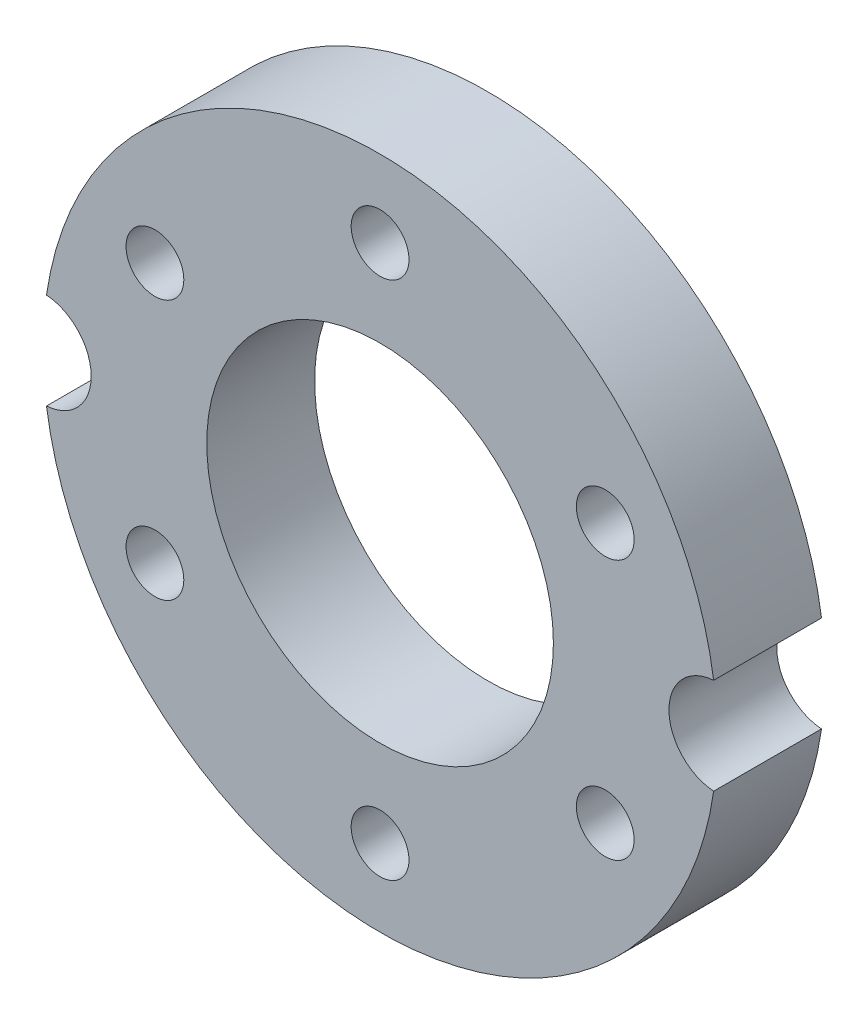
ISO-10303-21;
HEADER;
FILE_DESCRIPTION(('STEP AP214'),'2;1');
FILE_NAME('part.step','',(''),(''),'','','');
FILE_SCHEMA(('AUTOMOTIVE_DESIGN { 1 0 10303 214 1 1 1 1 }'));
ENDSEC;
DATA;
#1=APPLICATION_CONTEXT('core data for automotive mechanical design processes');
#2=APPLICATION_PROTOCOL_DEFINITION('international standard','automotive_design',2000,#1);
#3=PRODUCT_CONTEXT('',#1,'mechanical');
#4=PRODUCT('Part','Part','',(#3));
#5=PRODUCT_RELATED_PRODUCT_CATEGORY('part','',(#4));
#6=PRODUCT_DEFINITION_FORMATION('','',#4);
#7=PRODUCT_DEFINITION_CONTEXT('part definition',#1,'design');
#8=PRODUCT_DEFINITION('design','',#6,#7);
#9=PRODUCT_DEFINITION_SHAPE('','',#8);
#10=(LENGTH_UNIT() NAMED_UNIT(*) SI_UNIT(.MILLI.,.METRE.));
#11=(NAMED_UNIT(*) PLANE_ANGLE_UNIT() SI_UNIT($,.RADIAN.));
#12=(NAMED_UNIT(*) SI_UNIT($,.STERADIAN.) SOLID_ANGLE_UNIT());
#13=UNCERTAINTY_MEASURE_WITH_UNIT(LENGTH_MEASURE(1.E-05),#10,'distance_accuracy_value','');
#14=(GEOMETRIC_REPRESENTATION_CONTEXT(3) GLOBAL_UNCERTAINTY_ASSIGNED_CONTEXT((#13)) GLOBAL_UNIT_ASSIGNED_CONTEXT((#10,
#11,#12)) REPRESENTATION_CONTEXT('',''));
#15=CARTESIAN_POINT('',(0.,0.,0.));
#16=DIRECTION('',(0.,0.,1.));
#17=DIRECTION('',(1.,0.,0.));
#18=AXIS2_PLACEMENT_3D('',#15,#16,#17);
#19=CARTESIAN_POINT('',(0.,0.,5.6));
#20=DIRECTION('',(0.,0.,-1.));
#21=DIRECTION('',(-1.,0.,0.));
#22=AXIS2_PLACEMENT_3D('',#19,#20,#21);
#23=CYLINDRICAL_SURFACE('',#22,17.5);
#24=CARTESIAN_POINT('',(0.,0.,0.));
#25=DIRECTION('',(0.,0.,1.));
#26=DIRECTION('',(1.,0.,0.));
#27=AXIS2_PLACEMENT_3D('',#24,#25,#26);
#28=CIRCLE('',#27,17.5);
#29=CARTESIAN_POINT('',(-17.3214285714286,-2.49361429353015,0.));
#30=VERTEX_POINT('',#29);
#31=CARTESIAN_POINT('',(17.3214285714286,-2.49361429353015,0.));
#32=VERTEX_POINT('',#31);
#33=EDGE_CURVE('E135',#30,#32,#28,.T.);
#34=ORIENTED_EDGE('',*,*,#33,.T.);
#35=DIRECTION('',(0.,0.,-1.));
#36=VECTOR('',#35,1.);
#37=CARTESIAN_POINT('',(17.3214285714286,-2.49361429353015,5.6));
#38=LINE('',#37,#36);
#39=CARTESIAN_POINT('',(17.3214285714286,-2.49361429353015,5.6));
#40=VERTEX_POINT('',#39);
#41=EDGE_CURVE('E11',#40,#32,#38,.T.);
#42=ORIENTED_EDGE('',*,*,#41,.F.);
#43=CARTESIAN_POINT('',(0.,0.,5.6));
#44=DIRECTION('',(0.,0.,1.));
#45=DIRECTION('',(1.,0.,0.));
#46=AXIS2_PLACEMENT_3D('',#43,#44,#45);
#47=CIRCLE('',#46,17.5);
#48=CARTESIAN_POINT('',(-17.3214285714286,-2.49361429353015,5.6));
#49=VERTEX_POINT('',#48);
#50=EDGE_CURVE('E91',#49,#40,#47,.T.);
#51=ORIENTED_EDGE('',*,*,#50,.F.);
#52=DIRECTION('',(0.,0.,-1.));
#53=VECTOR('',#52,1.);
#54=CARTESIAN_POINT('',(-17.3214285714286,-2.49361429353015,5.6));
#55=LINE('',#54,#53);
#56=EDGE_CURVE('E57',#49,#30,#55,.T.);
#57=ORIENTED_EDGE('',*,*,#56,.T.);
#58=EDGE_LOOP('',(#34,#42,#51,#57));
#59=FACE_BOUND('',#58,.T.);
#60=ADVANCED_FACE('F40',(#59),#23,.T.);
#61=CARTESIAN_POINT('',(17.5,0.,5.6));
#62=DIRECTION('',(0.,0.,-1.));
#63=DIRECTION('',(-1.,0.,0.));
#64=AXIS2_PLACEMENT_3D('',#61,#62,#63);
#65=CYLINDRICAL_SURFACE('',#64,2.5);
#66=CARTESIAN_POINT('',(17.5,0.,0.));
#67=DIRECTION('',(0.,0.,1.));
#68=DIRECTION('',(1.,0.,0.));
#69=AXIS2_PLACEMENT_3D('',#66,#67,#68);
#70=CIRCLE('',#69,2.5);
#71=CARTESIAN_POINT('',(17.3214285714286,2.49361429353016,0.));
#72=VERTEX_POINT('',#71);
#73=EDGE_CURVE('E96',#32,#72,#70,.F.);
#74=ORIENTED_EDGE('',*,*,#73,.T.);
#75=DIRECTION('',(0.,0.,-1.));
#76=VECTOR('',#75,1.);
#77=CARTESIAN_POINT('',(17.3214285714286,2.49361429353016,5.6));
#78=LINE('',#77,#76);
#79=CARTESIAN_POINT('',(17.3214285714286,2.49361429353016,5.6));
#80=VERTEX_POINT('',#79);
#81=EDGE_CURVE('E49',#80,#72,#78,.T.);
#82=ORIENTED_EDGE('',*,*,#81,.F.);
#83=CARTESIAN_POINT('',(17.5,0.,5.6));
#84=DIRECTION('',(0.,0.,1.));
#85=DIRECTION('',(1.,0.,0.));
#86=AXIS2_PLACEMENT_3D('',#83,#84,#85);
#87=CIRCLE('',#86,2.5);
#88=EDGE_CURVE('E83',#40,#80,#87,.F.);
#89=ORIENTED_EDGE('',*,*,#88,.F.);
#90=ORIENTED_EDGE('',*,*,#41,.T.);
#91=EDGE_LOOP('',(#74,#82,#89,#90));
#92=FACE_BOUND('',#91,.T.);
#93=ADVANCED_FACE('F95',(#92),#65,.F.);
#94=CARTESIAN_POINT('',(-17.3214285714286,2.49361429353015,0.));
#95=VERTEX_POINT('',#94);
#96=EDGE_CURVE('E137',#72,#95,#28,.T.);
#97=ORIENTED_EDGE('',*,*,#96,.T.);
#98=DIRECTION('',(0.,0.,-1.));
#99=VECTOR('',#98,1.);
#100=CARTESIAN_POINT('',(-17.3214285714286,2.49361429353015,5.6));
#101=LINE('',#100,#99);
#102=CARTESIAN_POINT('',(-17.3214285714286,2.49361429353015,5.6));
#103=VERTEX_POINT('',#102);
#104=EDGE_CURVE('E72',#103,#95,#101,.T.);
#105=ORIENTED_EDGE('',*,*,#104,.F.);
#106=EDGE_CURVE('E90',#80,#103,#47,.T.);
#107=ORIENTED_EDGE('',*,*,#106,.F.);
#108=ORIENTED_EDGE('',*,*,#81,.T.);
#109=EDGE_LOOP('',(#97,#105,#107,#108));
#110=FACE_BOUND('',#109,.T.);
#111=ADVANCED_FACE('F99',(#110),#23,.T.);
#112=CARTESIAN_POINT('',(11.6913429510899,6.75000000000001,5.6));
#113=DIRECTION('',(0.,0.,-1.));
#114=DIRECTION('',(-1.,0.,0.));
#115=AXIS2_PLACEMENT_3D('',#112,#113,#114);
#116=CYLINDRICAL_SURFACE('',#115,1.5);
#117=CARTESIAN_POINT('',(11.6913429510899,6.75000000000001,5.6));
#118=DIRECTION('',(0.,0.,1.));
#119=DIRECTION('',(1.,0.,0.));
#120=AXIS2_PLACEMENT_3D('',#117,#118,#119);
#121=CIRCLE('',#120,1.5);
#122=CARTESIAN_POINT('',(13.1913429510899,6.75000000000001,5.6));
#123=VERTEX_POINT('',#122);
#124=EDGE_CURVE('E123',#123,#123,#121,.T.);
#125=ORIENTED_EDGE('',*,*,#124,.T.);
#126=EDGE_LOOP('',(#125));
#127=FACE_BOUND('',#126,.T.);
#128=CARTESIAN_POINT('',(11.6913429510899,6.75000000000001,0.));
#129=DIRECTION('',(0.,0.,1.));
#130=DIRECTION('',(1.,0.,0.));
#131=AXIS2_PLACEMENT_3D('',#128,#129,#130);
#132=CIRCLE('',#131,1.5);
#133=CARTESIAN_POINT('',(13.1913429510899,6.75000000000001,0.));
#134=VERTEX_POINT('',#133);
#135=EDGE_CURVE('E111',#134,#134,#132,.T.);
#136=ORIENTED_EDGE('',*,*,#135,.F.);
#137=EDGE_LOOP('',(#136));
#138=FACE_BOUND('',#137,.T.);
#139=ADVANCED_FACE('F159',(#127,#138),#116,.F.);
#140=CARTESIAN_POINT('',(-11.6913429510899,-6.75000000000001,5.6));
#141=DIRECTION('',(0.,0.,-1.));
#142=DIRECTION('',(-1.,0.,0.));
#143=AXIS2_PLACEMENT_3D('',#140,#141,#142);
#144=CYLINDRICAL_SURFACE('',#143,1.5);
#145=CARTESIAN_POINT('',(-11.6913429510899,-6.75000000000001,5.6));
#146=DIRECTION('',(0.,0.,1.));
#147=DIRECTION('',(1.,0.,0.));
#148=AXIS2_PLACEMENT_3D('',#145,#146,#147);
#149=CIRCLE('',#148,1.5);
#150=CARTESIAN_POINT('',(-10.1913429510899,-6.75000000000001,5.6));
#151=VERTEX_POINT('',#150);
#152=EDGE_CURVE('E128',#151,#151,#149,.T.);
#153=ORIENTED_EDGE('',*,*,#152,.T.);
#154=EDGE_LOOP('',(#153));
#155=FACE_BOUND('',#154,.T.);
#156=CARTESIAN_POINT('',(-11.6913429510899,-6.75000000000001,0.));
#157=DIRECTION('',(0.,0.,1.));
#158=DIRECTION('',(1.,0.,0.));
#159=AXIS2_PLACEMENT_3D('',#156,#157,#158);
#160=CIRCLE('',#159,1.5);
#161=CARTESIAN_POINT('',(-10.1913429510899,-6.75000000000001,0.));
#162=VERTEX_POINT('',#161);
#163=EDGE_CURVE('E116',#162,#162,#160,.T.);
#164=ORIENTED_EDGE('',*,*,#163,.F.);
#165=EDGE_LOOP('',(#164));
#166=FACE_BOUND('',#165,.T.);
#167=ADVANCED_FACE('F156',(#155,#166),#144,.F.);
#168=CARTESIAN_POINT('',(-11.6913429510899,6.74999999999999,5.6));
#169=DIRECTION('',(0.,0.,-1.));
#170=DIRECTION('',(-1.,0.,0.));
#171=AXIS2_PLACEMENT_3D('',#168,#169,#170);
#172=CYLINDRICAL_SURFACE('',#171,1.5);
#173=CARTESIAN_POINT('',(-11.6913429510899,6.74999999999999,5.6));
#174=DIRECTION('',(0.,0.,1.));
#175=DIRECTION('',(1.,0.,0.));
#176=AXIS2_PLACEMENT_3D('',#173,#174,#175);
#177=CIRCLE('',#176,1.5);
#178=CARTESIAN_POINT('',(-10.1913429510899,6.74999999999999,5.6));
#179=VERTEX_POINT('',#178);
#180=EDGE_CURVE('E322',#179,#179,#177,.T.);
#181=ORIENTED_EDGE('',*,*,#180,.T.);
#182=EDGE_LOOP('',(#181));
#183=FACE_BOUND('',#182,.T.);
#184=CARTESIAN_POINT('',(-11.6913429510899,6.74999999999999,0.));
#185=DIRECTION('',(0.,0.,1.));
#186=DIRECTION('',(1.,0.,0.));
#187=AXIS2_PLACEMENT_3D('',#184,#185,#186);
#188=CIRCLE('',#187,1.5);
#189=CARTESIAN_POINT('',(-10.1913429510899,6.74999999999999,0.));
#190=VERTEX_POINT('',#189);
#191=EDGE_CURVE('E148',#190,#190,#188,.T.);
#192=ORIENTED_EDGE('',*,*,#191,.F.);
#193=EDGE_LOOP('',(#192));
#194=FACE_BOUND('',#193,.T.);
#195=ADVANCED_FACE('F158',(#183,#194),#172,.F.);
#196=CARTESIAN_POINT('',(0.,0.,5.6));
#197=DIRECTION('',(0.,0.,-1.));
#198=DIRECTION('',(-1.,0.,0.));
#199=AXIS2_PLACEMENT_3D('',#196,#197,#198);
#200=CYLINDRICAL_SURFACE('',#199,9.);
#201=CARTESIAN_POINT('',(0.,0.,5.6));
#202=DIRECTION('',(0.,0.,1.));
#203=DIRECTION('',(1.,0.,0.));
#204=AXIS2_PLACEMENT_3D('',#201,#202,#203);
#205=CIRCLE('',#204,9.);
#206=CARTESIAN_POINT('',(9.,0.,5.6));
#207=VERTEX_POINT('',#206);
#208=EDGE_CURVE('E319',#207,#207,#205,.T.);
#209=ORIENTED_EDGE('',*,*,#208,.T.);
#210=EDGE_LOOP('',(#209));
#211=FACE_BOUND('',#210,.T.);
#212=CARTESIAN_POINT('',(0.,0.,0.));
#213=DIRECTION('',(0.,0.,1.));
#214=DIRECTION('',(1.,0.,0.));
#215=AXIS2_PLACEMENT_3D('',#212,#213,#214);
#216=CIRCLE('',#215,9.);
#217=CARTESIAN_POINT('',(9.,0.,0.));
#218=VERTEX_POINT('',#217);
#219=EDGE_CURVE('E145',#218,#218,#216,.T.);
#220=ORIENTED_EDGE('',*,*,#219,.F.);
#221=EDGE_LOOP('',(#220));
#222=FACE_BOUND('',#221,.T.);
#223=ADVANCED_FACE('F166',(#211,#222),#200,.F.);
#224=CARTESIAN_POINT('',(0.,-13.5,5.6));
#225=DIRECTION('',(0.,0.,-1.));
#226=DIRECTION('',(-1.,0.,0.));
#227=AXIS2_PLACEMENT_3D('',#224,#225,#226);
#228=CYLINDRICAL_SURFACE('',#227,1.5);
#229=CARTESIAN_POINT('',(0.,-13.5,5.6));
#230=DIRECTION('',(0.,0.,1.));
#231=DIRECTION('',(1.,0.,0.));
#232=AXIS2_PLACEMENT_3D('',#229,#230,#231);
#233=CIRCLE('',#232,1.5);
#234=CARTESIAN_POINT('',(1.5,-13.5,5.6));
#235=VERTEX_POINT('',#234);
#236=EDGE_CURVE('E102',#235,#235,#233,.T.);
#237=ORIENTED_EDGE('',*,*,#236,.T.);
#238=EDGE_LOOP('',(#237));
#239=FACE_BOUND('',#238,.T.);
#240=CARTESIAN_POINT('',(0.,-13.5,0.));
#241=DIRECTION('',(0.,0.,1.));
#242=DIRECTION('',(1.,0.,0.));
#243=AXIS2_PLACEMENT_3D('',#240,#241,#242);
#244=CIRCLE('',#243,1.5);
#245=CARTESIAN_POINT('',(1.5,-13.5,0.));
#246=VERTEX_POINT('',#245);
#247=EDGE_CURVE('E142',#246,#246,#244,.T.);
#248=ORIENTED_EDGE('',*,*,#247,.F.);
#249=EDGE_LOOP('',(#248));
#250=FACE_BOUND('',#249,.T.);
#251=ADVANCED_FACE('F209',(#239,#250),#228,.F.);
#252=CARTESIAN_POINT('',(-17.5,0.,5.6));
#253=DIRECTION('',(0.,0.,-1.));
#254=DIRECTION('',(-1.,0.,0.));
#255=AXIS2_PLACEMENT_3D('',#252,#253,#254);
#256=CYLINDRICAL_SURFACE('',#255,2.5);
#257=CARTESIAN_POINT('',(-17.5,0.,0.));
#258=DIRECTION('',(0.,0.,1.));
#259=DIRECTION('',(1.,0.,0.));
#260=AXIS2_PLACEMENT_3D('',#257,#258,#259);
#261=CIRCLE('',#260,2.5);
#262=EDGE_CURVE('E139',#30,#95,#261,.T.);
#263=ORIENTED_EDGE('',*,*,#262,.F.);
#264=ORIENTED_EDGE('',*,*,#56,.F.);
#265=CARTESIAN_POINT('',(-17.5,0.,5.6));
#266=DIRECTION('',(0.,0.,1.));
#267=DIRECTION('',(1.,0.,0.));
#268=AXIS2_PLACEMENT_3D('',#265,#266,#267);
#269=CIRCLE('',#268,2.5);
#270=EDGE_CURVE('E100',#49,#103,#269,.T.);
#271=ORIENTED_EDGE('',*,*,#270,.T.);
#272=ORIENTED_EDGE('',*,*,#104,.T.);
#273=EDGE_LOOP('',(#263,#264,#271,#272));
#274=FACE_BOUND('',#273,.T.);
#275=ADVANCED_FACE('F220',(#274),#256,.F.);
#276=CARTESIAN_POINT('',(0.,13.5,5.6));
#277=DIRECTION('',(0.,0.,-1.));
#278=DIRECTION('',(-1.,0.,0.));
#279=AXIS2_PLACEMENT_3D('',#276,#277,#278);
#280=CYLINDRICAL_SURFACE('',#279,1.5);
#281=CARTESIAN_POINT('',(0.,13.5,5.6));
#282=DIRECTION('',(0.,0.,1.));
#283=DIRECTION('',(1.,0.,0.));
#284=AXIS2_PLACEMENT_3D('',#281,#282,#283);
#285=CIRCLE('',#284,1.5);
#286=CARTESIAN_POINT('',(1.5,13.5,5.6));
#287=VERTEX_POINT('',#286);
#288=EDGE_CURVE('E105',#287,#287,#285,.T.);
#289=ORIENTED_EDGE('',*,*,#288,.T.);
#290=EDGE_LOOP('',(#289));
#291=FACE_BOUND('',#290,.T.);
#292=CARTESIAN_POINT('',(0.,13.5,0.));
#293=DIRECTION('',(0.,0.,1.));
#294=DIRECTION('',(1.,0.,0.));
#295=AXIS2_PLACEMENT_3D('',#292,#293,#294);
#296=CIRCLE('',#295,1.5);
#297=CARTESIAN_POINT('',(1.5,13.5,0.));
#298=VERTEX_POINT('',#297);
#299=EDGE_CURVE('E132',#298,#298,#296,.T.);
#300=ORIENTED_EDGE('',*,*,#299,.F.);
#301=EDGE_LOOP('',(#300));
#302=FACE_BOUND('',#301,.T.);
#303=ADVANCED_FACE('F42',(#291,#302),#280,.F.);
#304=CARTESIAN_POINT('',(11.6913429510899,-6.75,5.6));
#305=DIRECTION('',(0.,0.,-1.));
#306=DIRECTION('',(-1.,0.,0.));
#307=AXIS2_PLACEMENT_3D('',#304,#305,#306);
#308=CYLINDRICAL_SURFACE('',#307,1.5);
#309=CARTESIAN_POINT('',(11.6913429510899,-6.75,5.6));
#310=DIRECTION('',(0.,0.,1.));
#311=DIRECTION('',(1.,0.,0.));
#312=AXIS2_PLACEMENT_3D('',#309,#310,#311);
#313=CIRCLE('',#312,1.5);
#314=CARTESIAN_POINT('',(13.1913429510899,-6.75,5.6));
#315=VERTEX_POINT('',#314);
#316=EDGE_CURVE('E121',#315,#315,#313,.T.);
#317=ORIENTED_EDGE('',*,*,#316,.T.);
#318=EDGE_LOOP('',(#317));
#319=FACE_BOUND('',#318,.T.);
#320=CARTESIAN_POINT('',(11.6913429510899,-6.75,0.));
#321=DIRECTION('',(0.,0.,1.));
#322=DIRECTION('',(1.,0.,0.));
#323=AXIS2_PLACEMENT_3D('',#320,#321,#322);
#324=CIRCLE('',#323,1.5);
#325=CARTESIAN_POINT('',(13.1913429510899,-6.75,0.));
#326=VERTEX_POINT('',#325);
#327=EDGE_CURVE('E107',#326,#326,#324,.T.);
#328=ORIENTED_EDGE('',*,*,#327,.F.);
#329=EDGE_LOOP('',(#328));
#330=FACE_BOUND('',#329,.T.);
#331=ADVANCED_FACE('F239',(#319,#330),#308,.F.);
#332=CARTESIAN_POINT('',(0.,0.,5.6));
#333=DIRECTION('',(0.,0.,1.));
#334=DIRECTION('',(1.,0.,0.));
#335=AXIS2_PLACEMENT_3D('',#332,#333,#334);
#336=PLANE('',#335);
#337=ORIENTED_EDGE('',*,*,#288,.F.);
#338=EDGE_LOOP('',(#337));
#339=FACE_BOUND('',#338,.T.);
#340=ORIENTED_EDGE('',*,*,#50,.T.);
#341=ORIENTED_EDGE('',*,*,#88,.T.);
#342=ORIENTED_EDGE('',*,*,#106,.T.);
#343=ORIENTED_EDGE('',*,*,#270,.F.);
#344=EDGE_LOOP('',(#340,#341,#342,#343));
#345=FACE_BOUND('',#344,.T.);
#346=ORIENTED_EDGE('',*,*,#236,.F.);
#347=EDGE_LOOP('',(#346));
#348=FACE_BOUND('',#347,.T.);
#349=ORIENTED_EDGE('',*,*,#208,.F.);
#350=EDGE_LOOP('',(#349));
#351=FACE_BOUND('',#350,.T.);
#352=ORIENTED_EDGE('',*,*,#180,.F.);
#353=EDGE_LOOP('',(#352));
#354=FACE_BOUND('',#353,.T.);
#355=ORIENTED_EDGE('',*,*,#152,.F.);
#356=EDGE_LOOP('',(#355));
#357=FACE_BOUND('',#356,.T.);
#358=ORIENTED_EDGE('',*,*,#124,.F.);
#359=EDGE_LOOP('',(#358));
#360=FACE_BOUND('',#359,.T.);
#361=ORIENTED_EDGE('',*,*,#316,.F.);
#362=EDGE_LOOP('',(#361));
#363=FACE_BOUND('',#362,.T.);
#364=ADVANCED_FACE('F86',(#339,#345,#348,#351,#354,#357,#360,#363),#336,.T.);
#365=CARTESIAN_POINT('',(0.,0.,0.));
#366=DIRECTION('',(0.,0.,1.));
#367=DIRECTION('',(1.,0.,0.));
#368=AXIS2_PLACEMENT_3D('',#365,#366,#367);
#369=PLANE('',#368);
#370=ORIENTED_EDGE('',*,*,#299,.T.);
#371=EDGE_LOOP('',(#370));
#372=FACE_BOUND('',#371,.T.);
#373=ORIENTED_EDGE('',*,*,#33,.F.);
#374=ORIENTED_EDGE('',*,*,#262,.T.);
#375=ORIENTED_EDGE('',*,*,#96,.F.);
#376=ORIENTED_EDGE('',*,*,#73,.F.);
#377=EDGE_LOOP('',(#373,#374,#375,#376));
#378=FACE_BOUND('',#377,.T.);
#379=ORIENTED_EDGE('',*,*,#247,.T.);
#380=EDGE_LOOP('',(#379));
#381=FACE_BOUND('',#380,.T.);
#382=ORIENTED_EDGE('',*,*,#219,.T.);
#383=EDGE_LOOP('',(#382));
#384=FACE_BOUND('',#383,.T.);
#385=ORIENTED_EDGE('',*,*,#191,.T.);
#386=EDGE_LOOP('',(#385));
#387=FACE_BOUND('',#386,.T.);
#388=ORIENTED_EDGE('',*,*,#163,.T.);
#389=EDGE_LOOP('',(#388));
#390=FACE_BOUND('',#389,.T.);
#391=ORIENTED_EDGE('',*,*,#135,.T.);
#392=EDGE_LOOP('',(#391));
#393=FACE_BOUND('',#392,.T.);
#394=ORIENTED_EDGE('',*,*,#327,.T.);
#395=EDGE_LOOP('',(#394));
#396=FACE_BOUND('',#395,.T.);
#397=ADVANCED_FACE('F153',(#372,#378,#381,#384,#387,#390,#393,#396),#369,.F.);
#398=CLOSED_SHELL('',(#60,#93,#111,#139,#167,#195,#223,#251,#275,#303,#331,#364,#397));
#399=MANIFOLD_SOLID_BREP('B2',#398);
#400=ADVANCED_BREP_SHAPE_REPRESENTATION('',(#18,#399),#14);
#401=SHAPE_DEFINITION_REPRESENTATION(#9,#400);
ENDSEC;
END-ISO-10303-21;
